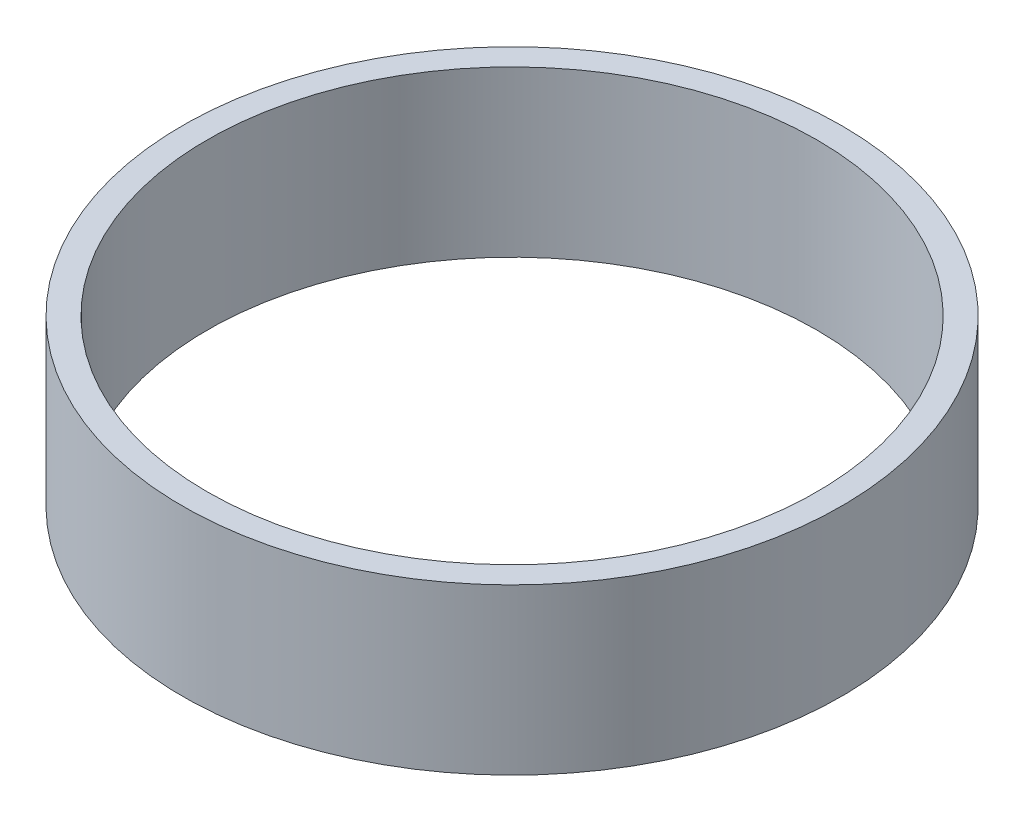
ISO-10303-21;
HEADER;
FILE_DESCRIPTION(('STEP AP214'),'2;1');
FILE_NAME('part.step','',(''),(''),'','','');
FILE_SCHEMA(('AUTOMOTIVE_DESIGN { 1 0 10303 214 1 1 1 1 }'));
ENDSEC;
DATA;
#1=APPLICATION_CONTEXT('core data for automotive mechanical design processes');
#2=APPLICATION_PROTOCOL_DEFINITION('international standard','automotive_design',2000,#1);
#3=PRODUCT_CONTEXT('',#1,'mechanical');
#4=PRODUCT('Part','Part','',(#3));
#5=PRODUCT_RELATED_PRODUCT_CATEGORY('part','',(#4));
#6=PRODUCT_DEFINITION_FORMATION('','',#4);
#7=PRODUCT_DEFINITION_CONTEXT('part definition',#1,'design');
#8=PRODUCT_DEFINITION('design','',#6,#7);
#9=PRODUCT_DEFINITION_SHAPE('','',#8);
#10=(LENGTH_UNIT() NAMED_UNIT(*) SI_UNIT(.MILLI.,.METRE.));
#11=(NAMED_UNIT(*) PLANE_ANGLE_UNIT() SI_UNIT($,.RADIAN.));
#12=(NAMED_UNIT(*) SI_UNIT($,.STERADIAN.) SOLID_ANGLE_UNIT());
#13=UNCERTAINTY_MEASURE_WITH_UNIT(LENGTH_MEASURE(1.E-05),#10,'distance_accuracy_value','');
#14=(GEOMETRIC_REPRESENTATION_CONTEXT(3) GLOBAL_UNCERTAINTY_ASSIGNED_CONTEXT((#13)) GLOBAL_UNIT_ASSIGNED_CONTEXT((#10,
#11,#12)) REPRESENTATION_CONTEXT('',''));
#15=CARTESIAN_POINT('',(0.,0.,0.));
#16=DIRECTION('',(0.,0.,1.));
#17=DIRECTION('',(1.,0.,0.));
#18=AXIS2_PLACEMENT_3D('',#15,#16,#17);
#19=CARTESIAN_POINT('',(0.,25.4,0.));
#20=DIRECTION('',(0.,-1.,0.));
#21=DIRECTION('',(0.,0.,-1.));
#22=AXIS2_PLACEMENT_3D('',#19,#20,#21);
#23=CYLINDRICAL_SURFACE('',#22,93.98);
#24=CARTESIAN_POINT('',(0.,-25.4,0.));
#25=DIRECTION('',(0.,-1.,0.));
#26=DIRECTION('',(0.,0.,-1.));
#27=AXIS2_PLACEMENT_3D('',#24,#25,#26);
#28=CIRCLE('',#27,93.98);
#29=CARTESIAN_POINT('',(0.,-25.4,-93.98));
#30=VERTEX_POINT('',#29);
#31=EDGE_CURVE('E27',#30,#30,#28,.T.);
#32=ORIENTED_EDGE('',*,*,#31,.T.);
#33=EDGE_LOOP('',(#32));
#34=FACE_BOUND('',#33,.T.);
#35=CARTESIAN_POINT('',(0.,25.4,0.));
#36=DIRECTION('',(0.,-1.,0.));
#37=DIRECTION('',(0.,0.,-1.));
#38=AXIS2_PLACEMENT_3D('',#35,#36,#37);
#39=CIRCLE('',#38,93.98);
#40=CARTESIAN_POINT('',(0.,25.4,-93.98));
#41=VERTEX_POINT('',#40);
#42=EDGE_CURVE('E18',#41,#41,#39,.T.);
#43=ORIENTED_EDGE('',*,*,#42,.F.);
#44=EDGE_LOOP('',(#43));
#45=FACE_BOUND('',#44,.T.);
#46=ADVANCED_FACE('F15',(#34,#45),#23,.F.);
#47=CARTESIAN_POINT('',(0.,25.4,0.));
#48=DIRECTION('',(0.,1.,0.));
#49=DIRECTION('',(0.,0.,1.));
#50=AXIS2_PLACEMENT_3D('',#47,#48,#49);
#51=PLANE('',#50);
#52=ORIENTED_EDGE('',*,*,#42,.T.);
#53=EDGE_LOOP('',(#52));
#54=FACE_BOUND('',#53,.T.);
#55=CARTESIAN_POINT('',(0.,25.4,0.));
#56=DIRECTION('',(0.,-1.,0.));
#57=DIRECTION('',(0.,0.,-1.));
#58=AXIS2_PLACEMENT_3D('',#55,#56,#57);
#59=CIRCLE('',#58,101.6);
#60=CARTESIAN_POINT('',(0.,25.4,-101.6));
#61=VERTEX_POINT('',#60);
#62=EDGE_CURVE('E22',#61,#61,#59,.T.);
#63=ORIENTED_EDGE('',*,*,#62,.F.);
#64=EDGE_LOOP('',(#63));
#65=FACE_BOUND('',#64,.T.);
#66=ADVANCED_FACE('F35',(#54,#65),#51,.T.);
#67=CARTESIAN_POINT('',(0.,-25.4,0.));
#68=DIRECTION('',(0.,1.,0.));
#69=DIRECTION('',(0.,0.,1.));
#70=AXIS2_PLACEMENT_3D('',#67,#68,#69);
#71=PLANE('',#70);
#72=ORIENTED_EDGE('',*,*,#31,.F.);
#73=EDGE_LOOP('',(#72));
#74=FACE_BOUND('',#73,.T.);
#75=CARTESIAN_POINT('',(0.,-25.4,0.));
#76=DIRECTION('',(0.,-1.,0.));
#77=DIRECTION('',(0.,0.,-1.));
#78=AXIS2_PLACEMENT_3D('',#75,#76,#77);
#79=CIRCLE('',#78,101.6);
#80=CARTESIAN_POINT('',(0.,-25.4,-101.6));
#81=VERTEX_POINT('',#80);
#82=EDGE_CURVE('E10',#81,#81,#79,.F.);
#83=ORIENTED_EDGE('',*,*,#82,.F.);
#84=EDGE_LOOP('',(#83));
#85=FACE_BOUND('',#84,.T.);
#86=ADVANCED_FACE('F43',(#74,#85),#71,.F.);
#87=CARTESIAN_POINT('',(0.,25.4,0.));
#88=DIRECTION('',(0.,-1.,0.));
#89=DIRECTION('',(0.,0.,-1.));
#90=AXIS2_PLACEMENT_3D('',#87,#88,#89);
#91=CYLINDRICAL_SURFACE('',#90,101.6);
#92=ORIENTED_EDGE('',*,*,#82,.T.);
#93=EDGE_LOOP('',(#92));
#94=FACE_BOUND('',#93,.T.);
#95=ORIENTED_EDGE('',*,*,#62,.T.);
#96=EDGE_LOOP('',(#95));
#97=FACE_BOUND('',#96,.T.);
#98=ADVANCED_FACE('F44',(#94,#97),#91,.T.);
#99=CLOSED_SHELL('',(#46,#66,#86,#98));
#100=MANIFOLD_SOLID_BREP('B1',#99);
#101=ADVANCED_BREP_SHAPE_REPRESENTATION('',(#18,#100),#14);
#102=SHAPE_DEFINITION_REPRESENTATION(#9,#101);
ENDSEC;
END-ISO-10303-21;
